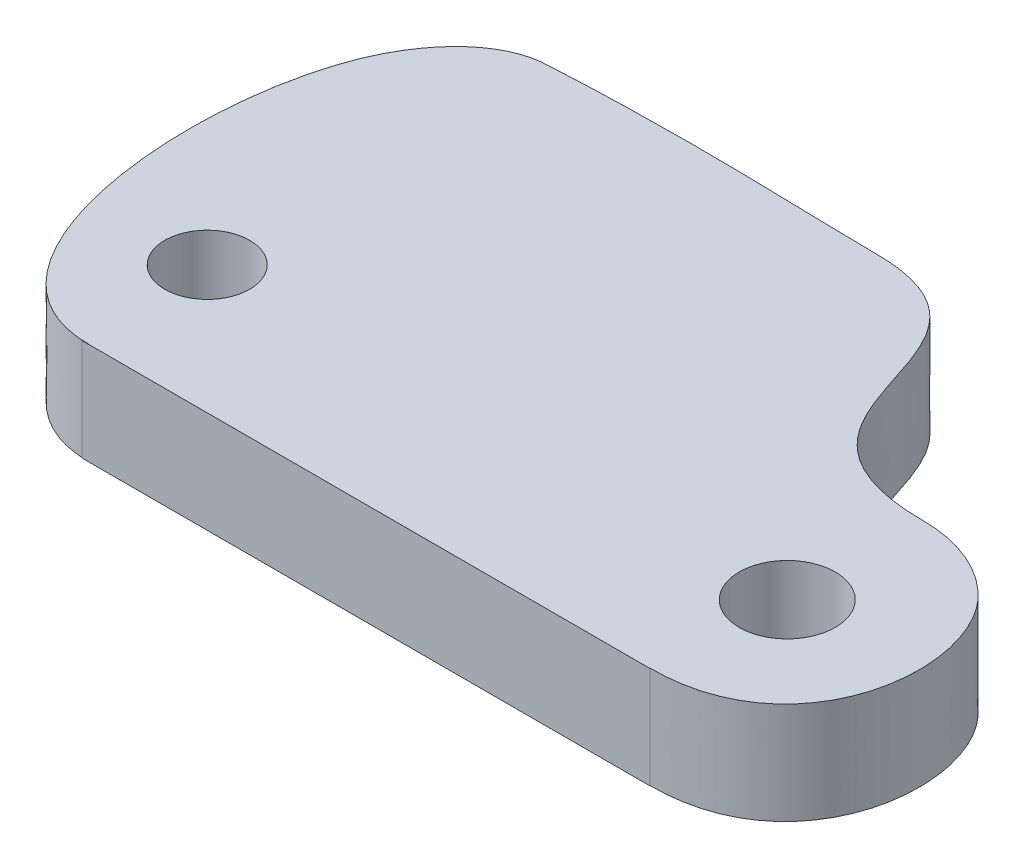
ISO-10303-21;
HEADER;
FILE_DESCRIPTION(('STEP AP214'),'2;1');
FILE_NAME('part.step','',(''),(''),'','','');
FILE_SCHEMA(('AUTOMOTIVE_DESIGN { 1 0 10303 214 1 1 1 1 }'));
ENDSEC;
DATA;
#1=APPLICATION_CONTEXT('core data for automotive mechanical design processes');
#2=APPLICATION_PROTOCOL_DEFINITION('international standard','automotive_design',2000,#1);
#3=PRODUCT_CONTEXT('',#1,'mechanical');
#4=PRODUCT('Part','Part','',(#3));
#5=PRODUCT_RELATED_PRODUCT_CATEGORY('part','',(#4));
#6=PRODUCT_DEFINITION_FORMATION('','',#4);
#7=PRODUCT_DEFINITION_CONTEXT('part definition',#1,'design');
#8=PRODUCT_DEFINITION('design','',#6,#7);
#9=PRODUCT_DEFINITION_SHAPE('','',#8);
#10=(LENGTH_UNIT() NAMED_UNIT(*) SI_UNIT(.MILLI.,.METRE.));
#11=(NAMED_UNIT(*) PLANE_ANGLE_UNIT() SI_UNIT($,.RADIAN.));
#12=(NAMED_UNIT(*) SI_UNIT($,.STERADIAN.) SOLID_ANGLE_UNIT());
#13=UNCERTAINTY_MEASURE_WITH_UNIT(LENGTH_MEASURE(1.E-05),#10,'distance_accuracy_value','');
#14=(GEOMETRIC_REPRESENTATION_CONTEXT(3) GLOBAL_UNCERTAINTY_ASSIGNED_CONTEXT((#13)) GLOBAL_UNIT_ASSIGNED_CONTEXT((#10,
#11,#12)) REPRESENTATION_CONTEXT('',''));
#15=CARTESIAN_POINT('',(0.,0.,0.));
#16=DIRECTION('',(0.,0.,1.));
#17=DIRECTION('',(1.,0.,0.));
#18=AXIS2_PLACEMENT_3D('',#15,#16,#17);
#19=CARTESIAN_POINT('',(45.8516855844644,3.175,-155.929762225575));
#20=DIRECTION('',(0.,-1.,0.));
#21=DIRECTION('',(0.,0.,-1.));
#22=AXIS2_PLACEMENT_3D('',#19,#20,#21);
#23=PLANE('',#22);
#24=CARTESIAN_POINT('',(23.9666605844644,3.175,-157.037137225575));
#25=DIRECTION('',(0.,1.,0.));
#26=DIRECTION('',(0.,0.,1.));
#27=AXIS2_PLACEMENT_3D('',#24,#25,#26);
#28=CIRCLE('',#27,1.3251);
#29=CARTESIAN_POINT('',(23.9666605844644,3.175,-155.712037225575));
#30=VERTEX_POINT('',#29);
#31=EDGE_CURVE('E145',#30,#30,#28,.T.);
#32=ORIENTED_EDGE('',*,*,#31,.F.);
#33=EDGE_LOOP('',(#32));
#34=FACE_BOUND('',#33,.T.);
#35=CARTESIAN_POINT('',(41.7808605844644,3.175,-153.047237225575));
#36=CARTESIAN_POINT('',(46.4724605844644,3.175,-153.023637225575));
#37=CARTESIAN_POINT('',(46.9379605844644,3.175,-158.355437225575));
#38=CARTESIAN_POINT('',(44.8013605844644,3.175,-160.253637225575));
#39=B_SPLINE_CURVE_WITH_KNOTS('',3,(#35,#36,#37,#38),.UNSPECIFIED.,.F.,.F.,(4,4),(0.3,0.4),.UNSPECIFIED.);
#40=CARTESIAN_POINT('',(41.7808605844644,3.175,-153.047237225575));
#41=VERTEX_POINT('',#40);
#42=CARTESIAN_POINT('',(44.8013605844644,3.175,-160.253637225575));
#43=VERTEX_POINT('',#42);
#44=EDGE_CURVE('E186',#41,#43,#39,.T.);
#45=ORIENTED_EDGE('',*,*,#44,.T.);
#46=CARTESIAN_POINT('',(44.8013605844644,3.175,-160.253637225575));
#47=CARTESIAN_POINT('',(44.0760605844644,3.175,-160.918437225575));
#48=CARTESIAN_POINT('',(43.0922605844644,3.175,-161.292037225575));
#49=CARTESIAN_POINT('',(42.0665605844644,3.175,-161.292037225575));
#50=B_SPLINE_CURVE_WITH_KNOTS('',3,(#46,#47,#48,#49),.UNSPECIFIED.,.F.,.F.,(4,4),(0.4,0.5),.UNSPECIFIED.);
#51=CARTESIAN_POINT('',(42.0665605844644,3.175,-161.292037225575));
#52=VERTEX_POINT('',#51);
#53=EDGE_CURVE('E99',#43,#52,#50,.T.);
#54=ORIENTED_EDGE('',*,*,#53,.T.);
#55=CARTESIAN_POINT('',(42.0665605844644,3.175,-161.292037225575));
#56=CARTESIAN_POINT('',(35.8727605844644,3.175,-161.305437225575));
#57=CARTESIAN_POINT('',(39.5755605844644,3.175,-167.746037225575));
#58=CARTESIAN_POINT('',(34.1226605844644,3.175,-167.769037225575));
#59=B_SPLINE_CURVE_WITH_KNOTS('',3,(#55,#56,#57,#58),.UNSPECIFIED.,.F.,.F.,(4,4),(0.5,0.6),.UNSPECIFIED.);
#60=CARTESIAN_POINT('',(34.1226605844644,3.175,-167.769037225575));
#61=VERTEX_POINT('',#60);
#62=EDGE_CURVE('E204',#52,#61,#59,.T.);
#63=ORIENTED_EDGE('',*,*,#62,.T.);
#64=CARTESIAN_POINT('',(34.1226605844644,3.175,-167.769037225575));
#65=CARTESIAN_POINT('',(31.6574605844644,3.175,-167.779437225575));
#66=CARTESIAN_POINT('',(28.3616605844644,3.175,-167.993537225575));
#67=CARTESIAN_POINT('',(23.9666605844644,3.175,-167.746037225575));
#68=B_SPLINE_CURVE_WITH_KNOTS('',3,(#64,#65,#66,#67),.UNSPECIFIED.,.F.,.F.,(4,4),(0.6,0.7),.UNSPECIFIED.);
#69=CARTESIAN_POINT('',(23.9666605844644,3.175,-167.746037225575));
#70=VERTEX_POINT('',#69);
#71=EDGE_CURVE('E221',#61,#70,#68,.T.);
#72=ORIENTED_EDGE('',*,*,#71,.T.);
#73=CARTESIAN_POINT('',(23.9666605844644,3.175,-167.746037225575));
#74=CARTESIAN_POINT('',(22.9409605844644,3.175,-167.746037225575));
#75=CARTESIAN_POINT('',(21.9571605844644,3.175,-167.079937225575));
#76=CARTESIAN_POINT('',(21.2318605844644,3.175,-165.894837225575));
#77=B_SPLINE_CURVE_WITH_KNOTS('',3,(#73,#74,#75,#76),.UNSPECIFIED.,.F.,.F.,(4,4),(0.7,0.8),.UNSPECIFIED.);
#78=CARTESIAN_POINT('',(21.2318605844644,3.175,-165.894837225575));
#79=VERTEX_POINT('',#78);
#80=EDGE_CURVE('E220',#70,#79,#77,.T.);
#81=ORIENTED_EDGE('',*,*,#80,.T.);
#82=CARTESIAN_POINT('',(21.2318605844644,3.175,-165.894837225575));
#83=CARTESIAN_POINT('',(19.0952605844644,3.175,-162.510837225575));
#84=CARTESIAN_POINT('',(19.5607605844644,3.175,-153.005437225575));
#85=CARTESIAN_POINT('',(24.2523605844644,3.175,-153.047337225575));
#86=B_SPLINE_CURVE_WITH_KNOTS('',3,(#82,#83,#84,#85),.UNSPECIFIED.,.F.,.F.,(4,4),(0.8,1.),.UNSPECIFIED.);
#87=CARTESIAN_POINT('',(24.2523605844644,3.175,-153.047337225575));
#88=VERTEX_POINT('',#87);
#89=EDGE_CURVE('E121',#79,#88,#86,.T.);
#90=ORIENTED_EDGE('',*,*,#89,.T.);
#91=DIRECTION('',(-0.998494900560416,0.,0.0548446310484871));
#92=VECTOR('',#91,1.);
#93=CARTESIAN_POINT('',(24.2523605844644,3.175,-153.047337225575));
#94=LINE('',#93,#92);
#95=CARTESIAN_POINT('',(24.0666605844644,3.175,-153.037137225575));
#96=VERTEX_POINT('',#95);
#97=EDGE_CURVE('E115',#88,#96,#94,.T.);
#98=ORIENTED_EDGE('',*,*,#97,.T.);
#99=DIRECTION('',(1.,0.,0.));
#100=VECTOR('',#99,1.);
#101=CARTESIAN_POINT('',(24.0666605844644,3.175,-153.037137225575));
#102=LINE('',#101,#100);
#103=CARTESIAN_POINT('',(41.7808605844644,3.175,-153.037137225575));
#104=VERTEX_POINT('',#103);
#105=EDGE_CURVE('E119',#96,#104,#102,.T.);
#106=ORIENTED_EDGE('',*,*,#105,.T.);
#107=DIRECTION('',(0.,0.,-1.));
#108=VECTOR('',#107,1.);
#109=CARTESIAN_POINT('',(41.7808605844644,3.175,-153.037137225575));
#110=LINE('',#109,#108);
#111=EDGE_CURVE('E53',#104,#41,#110,.T.);
#112=ORIENTED_EDGE('',*,*,#111,.T.);
#113=EDGE_LOOP('',(#45,#54,#63,#72,#81,#90,#98,#106,#112));
#114=FACE_BOUND('',#113,.T.);
#115=CARTESIAN_POINT('',(42.0664605844644,3.175,-157.037137225575));
#116=DIRECTION('',(0.,1.,0.));
#117=DIRECTION('',(0.,0.,1.));
#118=AXIS2_PLACEMENT_3D('',#115,#116,#117);
#119=CIRCLE('',#118,1.50020000000002);
#120=CARTESIAN_POINT('',(42.0664605844644,3.175,-155.536937225575));
#121=VERTEX_POINT('',#120);
#122=EDGE_CURVE('E270',#121,#121,#119,.T.);
#123=ORIENTED_EDGE('',*,*,#122,.F.);
#124=EDGE_LOOP('',(#123));
#125=FACE_BOUND('',#124,.T.);
#126=ADVANCED_FACE('F35',(#34,#114,#125),#23,.F.);
#127=CARTESIAN_POINT('',(45.8516855844644,0.,-155.929762225575));
#128=DIRECTION('',(0.,-1.,0.));
#129=DIRECTION('',(0.,0.,-1.));
#130=AXIS2_PLACEMENT_3D('',#127,#128,#129);
#131=PLANE('',#130);
#132=CARTESIAN_POINT('',(23.9666605844644,0.,-157.037137225575));
#133=DIRECTION('',(0.,1.,0.));
#134=DIRECTION('',(0.,0.,1.));
#135=AXIS2_PLACEMENT_3D('',#132,#133,#134);
#136=CIRCLE('',#135,1.3251);
#137=CARTESIAN_POINT('',(23.9666605844644,0.,-155.712037225575));
#138=VERTEX_POINT('',#137);
#139=EDGE_CURVE('E264',#138,#138,#136,.T.);
#140=ORIENTED_EDGE('',*,*,#139,.T.);
#141=EDGE_LOOP('',(#140));
#142=FACE_BOUND('',#141,.T.);
#143=CARTESIAN_POINT('',(41.7808605844644,0.,-153.047237225575));
#144=CARTESIAN_POINT('',(46.4724605844644,0.,-153.023637225575));
#145=CARTESIAN_POINT('',(46.9379605844644,0.,-158.355437225575));
#146=CARTESIAN_POINT('',(44.8013605844644,0.,-160.253637225575));
#147=B_SPLINE_CURVE_WITH_KNOTS('',3,(#143,#144,#145,#146),.UNSPECIFIED.,.F.,.F.,(4,4),(0.3,0.4),.UNSPECIFIED.);
#148=CARTESIAN_POINT('',(41.7808605844644,0.,-153.047237225575));
#149=VERTEX_POINT('',#148);
#150=CARTESIAN_POINT('',(44.8013605844644,0.,-160.253637225575));
#151=VERTEX_POINT('',#150);
#152=EDGE_CURVE('E139',#149,#151,#147,.T.);
#153=ORIENTED_EDGE('',*,*,#152,.F.);
#154=DIRECTION('',(0.,0.,-1.));
#155=VECTOR('',#154,1.);
#156=CARTESIAN_POINT('',(41.7808605844644,0.,-153.037137225575));
#157=LINE('',#156,#155);
#158=CARTESIAN_POINT('',(41.7808605844644,0.,-153.037137225575));
#159=VERTEX_POINT('',#158);
#160=EDGE_CURVE('E91',#159,#149,#157,.T.);
#161=ORIENTED_EDGE('',*,*,#160,.F.);
#162=DIRECTION('',(1.,0.,0.));
#163=VECTOR('',#162,1.);
#164=CARTESIAN_POINT('',(24.0666605844644,0.,-153.037137225575));
#165=LINE('',#164,#163);
#166=CARTESIAN_POINT('',(24.0666605844644,0.,-153.037137225575));
#167=VERTEX_POINT('',#166);
#168=EDGE_CURVE('E85',#167,#159,#165,.T.);
#169=ORIENTED_EDGE('',*,*,#168,.F.);
#170=DIRECTION('',(-0.998494900560416,0.,0.0548446310484871));
#171=VECTOR('',#170,1.);
#172=CARTESIAN_POINT('',(24.2523605844644,0.,-153.047337225575));
#173=LINE('',#172,#171);
#174=CARTESIAN_POINT('',(24.2523605844644,0.,-153.047337225575));
#175=VERTEX_POINT('',#174);
#176=EDGE_CURVE('E129',#175,#167,#173,.T.);
#177=ORIENTED_EDGE('',*,*,#176,.F.);
#178=CARTESIAN_POINT('',(21.2318605844644,0.,-165.894837225575));
#179=CARTESIAN_POINT('',(19.0952605844644,0.,-162.510837225575));
#180=CARTESIAN_POINT('',(19.5607605844644,0.,-153.005437225575));
#181=CARTESIAN_POINT('',(24.2523605844644,0.,-153.047337225575));
#182=B_SPLINE_CURVE_WITH_KNOTS('',3,(#178,#179,#180,#181),.UNSPECIFIED.,.F.,.F.,(4,4),(0.8,1.),.UNSPECIFIED.);
#183=CARTESIAN_POINT('',(21.2318605844644,0.,-165.894837225575));
#184=VERTEX_POINT('',#183);
#185=EDGE_CURVE('E173',#184,#175,#182,.T.);
#186=ORIENTED_EDGE('',*,*,#185,.F.);
#187=CARTESIAN_POINT('',(23.9666605844644,0.,-167.746037225575));
#188=CARTESIAN_POINT('',(22.9409605844644,0.,-167.746037225575));
#189=CARTESIAN_POINT('',(21.9571605844644,0.,-167.079937225575));
#190=CARTESIAN_POINT('',(21.2318605844644,0.,-165.894837225575));
#191=B_SPLINE_CURVE_WITH_KNOTS('',3,(#187,#188,#189,#190),.UNSPECIFIED.,.F.,.F.,(4,4),(0.7,0.8),.UNSPECIFIED.);
#192=CARTESIAN_POINT('',(23.9666605844644,0.,-167.746037225575));
#193=VERTEX_POINT('',#192);
#194=EDGE_CURVE('E166',#193,#184,#191,.T.);
#195=ORIENTED_EDGE('',*,*,#194,.F.);
#196=CARTESIAN_POINT('',(34.1226605844644,0.,-167.769037225575));
#197=CARTESIAN_POINT('',(31.6574605844644,0.,-167.779437225575));
#198=CARTESIAN_POINT('',(28.3616605844644,0.,-167.993537225575));
#199=CARTESIAN_POINT('',(23.9666605844644,0.,-167.746037225575));
#200=B_SPLINE_CURVE_WITH_KNOTS('',3,(#196,#197,#198,#199),.UNSPECIFIED.,.F.,.F.,(4,4),(0.6,0.7),.UNSPECIFIED.);
#201=CARTESIAN_POINT('',(34.1226605844644,0.,-167.769037225575));
#202=VERTEX_POINT('',#201);
#203=EDGE_CURVE('E159',#202,#193,#200,.T.);
#204=ORIENTED_EDGE('',*,*,#203,.F.);
#205=CARTESIAN_POINT('',(42.0665605844644,0.,-161.292037225575));
#206=CARTESIAN_POINT('',(35.8727605844644,0.,-161.305437225575));
#207=CARTESIAN_POINT('',(39.5755605844644,0.,-167.746037225575));
#208=CARTESIAN_POINT('',(34.1226605844644,0.,-167.769037225575));
#209=B_SPLINE_CURVE_WITH_KNOTS('',3,(#205,#206,#207,#208),.UNSPECIFIED.,.F.,.F.,(4,4),(0.5,0.6),.UNSPECIFIED.);
#210=CARTESIAN_POINT('',(42.0665605844644,0.,-161.292037225575));
#211=VERTEX_POINT('',#210);
#212=EDGE_CURVE('E152',#211,#202,#209,.T.);
#213=ORIENTED_EDGE('',*,*,#212,.F.);
#214=CARTESIAN_POINT('',(44.8013605844644,0.,-160.253637225575));
#215=CARTESIAN_POINT('',(44.0760605844644,0.,-160.918437225575));
#216=CARTESIAN_POINT('',(43.0922605844644,0.,-161.292037225575));
#217=CARTESIAN_POINT('',(42.0665605844644,0.,-161.292037225575));
#218=B_SPLINE_CURVE_WITH_KNOTS('',3,(#214,#215,#216,#217),.UNSPECIFIED.,.F.,.F.,(4,4),(0.4,0.5),.UNSPECIFIED.);
#219=EDGE_CURVE('E144',#151,#211,#218,.T.);
#220=ORIENTED_EDGE('',*,*,#219,.F.);
#221=EDGE_LOOP('',(#153,#161,#169,#177,#186,#195,#204,#213,#220));
#222=FACE_BOUND('',#221,.T.);
#223=CARTESIAN_POINT('',(42.0664605844644,0.,-157.037137225575));
#224=DIRECTION('',(0.,1.,0.));
#225=DIRECTION('',(0.,0.,1.));
#226=AXIS2_PLACEMENT_3D('',#223,#224,#225);
#227=CIRCLE('',#226,1.50020000000002);
#228=CARTESIAN_POINT('',(42.0664605844644,0.,-155.536937225575));
#229=VERTEX_POINT('',#228);
#230=EDGE_CURVE('E273',#229,#229,#227,.T.);
#231=ORIENTED_EDGE('',*,*,#230,.T.);
#232=EDGE_LOOP('',(#231));
#233=FACE_BOUND('',#232,.T.);
#234=ADVANCED_FACE('F208',(#142,#222,#233),#131,.T.);
#235=DIRECTION('',(0.,-1.,0.));
#236=VECTOR('',#235,1.);
#237=SURFACE_OF_LINEAR_EXTRUSION('',#39,#236);
#238=ORIENTED_EDGE('',*,*,#152,.T.);
#239=DIRECTION('',(0.,-1.,0.));
#240=VECTOR('',#239,1.);
#241=CARTESIAN_POINT('',(44.8013605844644,3.175,-160.253637225575));
#242=LINE('',#241,#240);
#243=EDGE_CURVE('E11',#43,#151,#242,.T.);
#244=ORIENTED_EDGE('',*,*,#243,.F.);
#245=ORIENTED_EDGE('',*,*,#44,.F.);
#246=DIRECTION('',(0.,-1.,0.));
#247=VECTOR('',#246,1.);
#248=CARTESIAN_POINT('',(41.7808605844644,3.175,-153.047237225575));
#249=LINE('',#248,#247);
#250=EDGE_CURVE('E135',#41,#149,#249,.T.);
#251=ORIENTED_EDGE('',*,*,#250,.T.);
#252=EDGE_LOOP('',(#238,#244,#245,#251));
#253=FACE_BOUND('',#252,.T.);
#254=ADVANCED_FACE('F37',(#253),#237,.F.);
#255=DIRECTION('',(0.,-1.,0.));
#256=VECTOR('',#255,1.);
#257=SURFACE_OF_LINEAR_EXTRUSION('',#50,#256);
#258=ORIENTED_EDGE('',*,*,#219,.T.);
#259=DIRECTION('',(0.,-1.,0.));
#260=VECTOR('',#259,1.);
#261=CARTESIAN_POINT('',(42.0665605844644,3.175,-161.292037225575));
#262=LINE('',#261,#260);
#263=EDGE_CURVE('E45',#52,#211,#262,.T.);
#264=ORIENTED_EDGE('',*,*,#263,.F.);
#265=ORIENTED_EDGE('',*,*,#53,.F.);
#266=ORIENTED_EDGE('',*,*,#243,.T.);
#267=EDGE_LOOP('',(#258,#264,#265,#266));
#268=FACE_BOUND('',#267,.T.);
#269=ADVANCED_FACE('F246',(#268),#257,.F.);
#270=DIRECTION('',(0.,-1.,0.));
#271=VECTOR('',#270,1.);
#272=SURFACE_OF_LINEAR_EXTRUSION('',#59,#271);
#273=ORIENTED_EDGE('',*,*,#212,.T.);
#274=DIRECTION('',(0.,-1.,0.));
#275=VECTOR('',#274,1.);
#276=CARTESIAN_POINT('',(34.1226605844644,3.175,-167.769037225575));
#277=LINE('',#276,#275);
#278=EDGE_CURVE('E196',#61,#202,#277,.T.);
#279=ORIENTED_EDGE('',*,*,#278,.F.);
#280=ORIENTED_EDGE('',*,*,#62,.F.);
#281=ORIENTED_EDGE('',*,*,#263,.T.);
#282=EDGE_LOOP('',(#273,#279,#280,#281));
#283=FACE_BOUND('',#282,.T.);
#284=ADVANCED_FACE('F202',(#283),#272,.F.);
#285=DIRECTION('',(0.,-1.,0.));
#286=VECTOR('',#285,1.);
#287=SURFACE_OF_LINEAR_EXTRUSION('',#68,#286);
#288=ORIENTED_EDGE('',*,*,#203,.T.);
#289=DIRECTION('',(0.,-1.,0.));
#290=VECTOR('',#289,1.);
#291=CARTESIAN_POINT('',(23.9666605844644,3.175,-167.746037225575));
#292=LINE('',#291,#290);
#293=EDGE_CURVE('E193',#70,#193,#292,.T.);
#294=ORIENTED_EDGE('',*,*,#293,.F.);
#295=ORIENTED_EDGE('',*,*,#71,.F.);
#296=ORIENTED_EDGE('',*,*,#278,.T.);
#297=EDGE_LOOP('',(#288,#294,#295,#296));
#298=FACE_BOUND('',#297,.T.);
#299=ADVANCED_FACE('F214',(#298),#287,.F.);
#300=DIRECTION('',(0.,-1.,0.));
#301=VECTOR('',#300,1.);
#302=SURFACE_OF_LINEAR_EXTRUSION('',#77,#301);
#303=ORIENTED_EDGE('',*,*,#194,.T.);
#304=DIRECTION('',(0.,-1.,0.));
#305=VECTOR('',#304,1.);
#306=CARTESIAN_POINT('',(21.2318605844644,3.175,-165.894837225575));
#307=LINE('',#306,#305);
#308=EDGE_CURVE('E190',#79,#184,#307,.T.);
#309=ORIENTED_EDGE('',*,*,#308,.F.);
#310=ORIENTED_EDGE('',*,*,#80,.F.);
#311=ORIENTED_EDGE('',*,*,#293,.T.);
#312=EDGE_LOOP('',(#303,#309,#310,#311));
#313=FACE_BOUND('',#312,.T.);
#314=ADVANCED_FACE('F218',(#313),#302,.F.);
#315=DIRECTION('',(0.,-1.,0.));
#316=VECTOR('',#315,1.);
#317=SURFACE_OF_LINEAR_EXTRUSION('',#86,#316);
#318=ORIENTED_EDGE('',*,*,#185,.T.);
#319=DIRECTION('',(0.,-1.,0.));
#320=VECTOR('',#319,1.);
#321=CARTESIAN_POINT('',(24.2523605844644,3.175,-153.047337225575));
#322=LINE('',#321,#320);
#323=EDGE_CURVE('E130',#88,#175,#322,.T.);
#324=ORIENTED_EDGE('',*,*,#323,.F.);
#325=ORIENTED_EDGE('',*,*,#89,.F.);
#326=ORIENTED_EDGE('',*,*,#308,.T.);
#327=EDGE_LOOP('',(#318,#324,#325,#326));
#328=FACE_BOUND('',#327,.T.);
#329=ADVANCED_FACE('F241',(#328),#317,.F.);
#330=CARTESIAN_POINT('',(24.2523605844644,3.175,-153.047337225575));
#331=DIRECTION('',(0.0548446310484871,0.,0.998494900560416));
#332=DIRECTION('',(0.998494900560416,0.,-0.0548446310484871));
#333=AXIS2_PLACEMENT_3D('',#330,#331,#332);
#334=PLANE('',#333);
#335=ORIENTED_EDGE('',*,*,#176,.T.);
#336=DIRECTION('',(0.,-1.,0.));
#337=VECTOR('',#336,1.);
#338=CARTESIAN_POINT('',(24.0666605844644,3.175,-153.037137225575));
#339=LINE('',#338,#337);
#340=EDGE_CURVE('E126',#96,#167,#339,.T.);
#341=ORIENTED_EDGE('',*,*,#340,.F.);
#342=ORIENTED_EDGE('',*,*,#97,.F.);
#343=ORIENTED_EDGE('',*,*,#323,.T.);
#344=EDGE_LOOP('',(#335,#341,#342,#343));
#345=FACE_BOUND('',#344,.T.);
#346=ADVANCED_FACE('F127',(#345),#334,.F.);
#347=CARTESIAN_POINT('',(24.0666605844644,3.175,-153.037137225575));
#348=DIRECTION('',(0.,0.,-1.));
#349=DIRECTION('',(-1.,0.,0.));
#350=AXIS2_PLACEMENT_3D('',#347,#348,#349);
#351=PLANE('',#350);
#352=ORIENTED_EDGE('',*,*,#168,.T.);
#353=DIRECTION('',(0.,-1.,0.));
#354=VECTOR('',#353,1.);
#355=CARTESIAN_POINT('',(41.7808605844644,3.175,-153.037137225575));
#356=LINE('',#355,#354);
#357=EDGE_CURVE('E131',#104,#159,#356,.T.);
#358=ORIENTED_EDGE('',*,*,#357,.F.);
#359=ORIENTED_EDGE('',*,*,#105,.F.);
#360=ORIENTED_EDGE('',*,*,#340,.T.);
#361=EDGE_LOOP('',(#352,#358,#359,#360));
#362=FACE_BOUND('',#361,.T.);
#363=ADVANCED_FACE('F133',(#362),#351,.F.);
#364=CARTESIAN_POINT('',(41.7808605844644,3.175,-153.037137225575));
#365=DIRECTION('',(-1.,0.,0.));
#366=DIRECTION('',(0.,0.,1.));
#367=AXIS2_PLACEMENT_3D('',#364,#365,#366);
#368=PLANE('',#367);
#369=ORIENTED_EDGE('',*,*,#160,.T.);
#370=ORIENTED_EDGE('',*,*,#250,.F.);
#371=ORIENTED_EDGE('',*,*,#111,.F.);
#372=ORIENTED_EDGE('',*,*,#357,.T.);
#373=EDGE_LOOP('',(#369,#370,#371,#372));
#374=FACE_BOUND('',#373,.T.);
#375=ADVANCED_FACE('F294',(#374),#368,.F.);
#376=CARTESIAN_POINT('',(23.9666605844644,3.175,-157.037137225575));
#377=DIRECTION('',(0.,-1.,0.));
#378=DIRECTION('',(0.,0.,-1.));
#379=AXIS2_PLACEMENT_3D('',#376,#377,#378);
#380=CYLINDRICAL_SURFACE('',#379,1.3251);
#381=ORIENTED_EDGE('',*,*,#31,.T.);
#382=EDGE_LOOP('',(#381));
#383=FACE_BOUND('',#382,.T.);
#384=ORIENTED_EDGE('',*,*,#139,.F.);
#385=EDGE_LOOP('',(#384));
#386=FACE_BOUND('',#385,.T.);
#387=ADVANCED_FACE('F291',(#383,#386),#380,.F.);
#388=CARTESIAN_POINT('',(42.0664605844644,3.175,-157.037137225575));
#389=DIRECTION('',(0.,-1.,0.));
#390=DIRECTION('',(0.,0.,-1.));
#391=AXIS2_PLACEMENT_3D('',#388,#389,#390);
#392=CYLINDRICAL_SURFACE('',#391,1.50020000000002);
#393=ORIENTED_EDGE('',*,*,#122,.T.);
#394=EDGE_LOOP('',(#393));
#395=FACE_BOUND('',#394,.T.);
#396=ORIENTED_EDGE('',*,*,#230,.F.);
#397=EDGE_LOOP('',(#396));
#398=FACE_BOUND('',#397,.T.);
#399=ADVANCED_FACE('F279',(#395,#398),#392,.F.);
#400=CLOSED_SHELL('',(#126,#234,#254,#269,#284,#299,#314,#329,#346,#363,#375,#387,#399));
#401=MANIFOLD_SOLID_BREP('B2',#400);
#402=ADVANCED_BREP_SHAPE_REPRESENTATION('',(#18,#401),#14);
#403=SHAPE_DEFINITION_REPRESENTATION(#9,#402);
ENDSEC;
END-ISO-10303-21;
